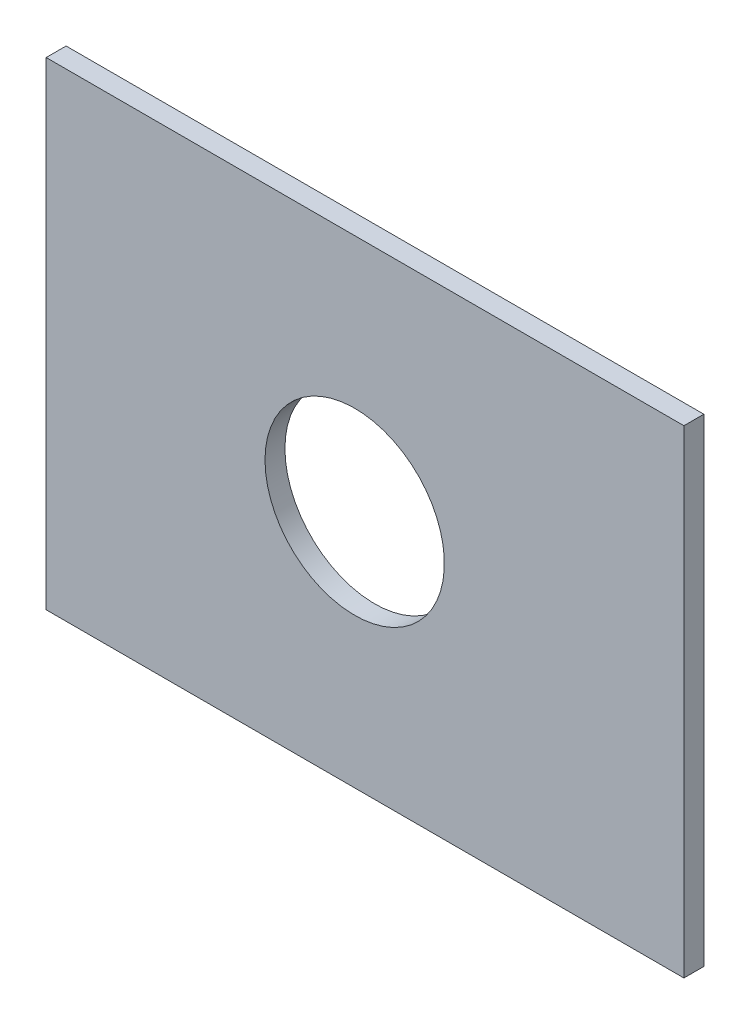
ISO-10303-21;
HEADER;
FILE_DESCRIPTION(('STEP AP214'),'2;1');
FILE_NAME('part.step','',(''),(''),'','','');
FILE_SCHEMA(('AUTOMOTIVE_DESIGN { 1 0 10303 214 1 1 1 1 }'));
ENDSEC;
DATA;
#1=APPLICATION_CONTEXT('core data for automotive mechanical design processes');
#2=APPLICATION_PROTOCOL_DEFINITION('international standard','automotive_design',2000,#1);
#3=PRODUCT_CONTEXT('',#1,'mechanical');
#4=PRODUCT('Part','Part','',(#3));
#5=PRODUCT_RELATED_PRODUCT_CATEGORY('part','',(#4));
#6=PRODUCT_DEFINITION_FORMATION('','',#4);
#7=PRODUCT_DEFINITION_CONTEXT('part definition',#1,'design');
#8=PRODUCT_DEFINITION('design','',#6,#7);
#9=PRODUCT_DEFINITION_SHAPE('','',#8);
#10=(LENGTH_UNIT() NAMED_UNIT(*) SI_UNIT(.MILLI.,.METRE.));
#11=(NAMED_UNIT(*) PLANE_ANGLE_UNIT() SI_UNIT($,.RADIAN.));
#12=(NAMED_UNIT(*) SI_UNIT($,.STERADIAN.) SOLID_ANGLE_UNIT());
#13=UNCERTAINTY_MEASURE_WITH_UNIT(LENGTH_MEASURE(1.E-05),#10,'distance_accuracy_value','');
#14=(GEOMETRIC_REPRESENTATION_CONTEXT(3) GLOBAL_UNCERTAINTY_ASSIGNED_CONTEXT((#13)) GLOBAL_UNIT_ASSIGNED_CONTEXT((#10,
#11,#12)) REPRESENTATION_CONTEXT('',''));
#15=CARTESIAN_POINT('',(0.,0.,0.));
#16=DIRECTION('',(0.,0.,1.));
#17=DIRECTION('',(1.,0.,0.));
#18=AXIS2_PLACEMENT_3D('',#15,#16,#17);
#19=CARTESIAN_POINT('',(0.,0.,-1439.49432926689));
#20=DIRECTION('',(0.,0.,1.));
#21=DIRECTION('',(1.,0.,0.));
#22=AXIS2_PLACEMENT_3D('',#19,#20,#21);
#23=PLANE('',#22);
#24=DIRECTION('',(0.,1.,0.));
#25=VECTOR('',#24,1.);
#26=CARTESIAN_POINT('',(-2270.31515009842,147.889080750159,-1439.49432926689));
#27=LINE('',#26,#25);
#28=CARTESIAN_POINT('',(-2270.31515009842,147.889080750159,-1439.49432926689));
#29=VERTEX_POINT('',#28);
#30=CARTESIAN_POINT('',(-2270.31515009842,224.089080750159,-1439.49432926689));
#31=VERTEX_POINT('',#30);
#32=EDGE_CURVE('E88',#29,#31,#27,.T.);
#33=ORIENTED_EDGE('',*,*,#32,.T.);
#34=DIRECTION('',(1.,0.,0.));
#35=VECTOR('',#34,1.);
#36=CARTESIAN_POINT('',(-2168.71515009842,224.089080750159,-1439.49432926689));
#37=LINE('',#36,#35);
#38=CARTESIAN_POINT('',(-2168.71515009842,224.089080750159,-1439.49432926689));
#39=VERTEX_POINT('',#38);
#40=EDGE_CURVE('E83',#31,#39,#37,.T.);
#41=ORIENTED_EDGE('',*,*,#40,.T.);
#42=DIRECTION('',(0.,-1.,0.));
#43=VECTOR('',#42,1.);
#44=CARTESIAN_POINT('',(-2168.71515009842,147.889080750159,-1439.49432926689));
#45=LINE('',#44,#43);
#46=CARTESIAN_POINT('',(-2168.71515009842,147.889080750159,-1439.49432926689));
#47=VERTEX_POINT('',#46);
#48=EDGE_CURVE('E86',#39,#47,#45,.T.);
#49=ORIENTED_EDGE('',*,*,#48,.T.);
#50=DIRECTION('',(-1.,0.,0.));
#51=VECTOR('',#50,1.);
#52=CARTESIAN_POINT('',(-2168.71515009842,147.889080750159,-1439.49432926689));
#53=LINE('',#52,#51);
#54=EDGE_CURVE('E53',#47,#29,#53,.T.);
#55=ORIENTED_EDGE('',*,*,#54,.T.);
#56=EDGE_LOOP('',(#33,#41,#49,#55));
#57=FACE_BOUND('',#56,.T.);
#58=CARTESIAN_POINT('',(-2221.16513035462,185.989080750166,-1439.49432926689));
#59=DIRECTION('',(0.,0.,-1.));
#60=DIRECTION('',(-1.,0.,0.));
#61=AXIS2_PLACEMENT_3D('',#58,#59,#60);
#62=CIRCLE('',#61,14.287499999999);
#63=CARTESIAN_POINT('',(-2235.45263035462,185.989080750166,-1439.49432926689));
#64=VERTEX_POINT('',#63);
#65=EDGE_CURVE('E103',#64,#64,#62,.T.);
#66=ORIENTED_EDGE('',*,*,#65,.F.);
#67=EDGE_LOOP('',(#66));
#68=FACE_BOUND('',#67,.T.);
#69=ADVANCED_FACE('F36',(#57,#68),#23,.F.);
#70=CARTESIAN_POINT('',(0.,0.,-1436.31932926689));
#71=DIRECTION('',(0.,0.,1.));
#72=DIRECTION('',(1.,0.,0.));
#73=AXIS2_PLACEMENT_3D('',#70,#71,#72);
#74=PLANE('',#73);
#75=DIRECTION('',(0.,1.,0.));
#76=VECTOR('',#75,1.);
#77=CARTESIAN_POINT('',(-2270.31515009842,147.889080750159,-1436.31932926689));
#78=LINE('',#77,#76);
#79=CARTESIAN_POINT('',(-2270.31515009842,147.889080750159,-1436.31932926689));
#80=VERTEX_POINT('',#79);
#81=CARTESIAN_POINT('',(-2270.31515009842,224.089080750159,-1436.31932926689));
#82=VERTEX_POINT('',#81);
#83=EDGE_CURVE('E100',#80,#82,#78,.T.);
#84=ORIENTED_EDGE('',*,*,#83,.F.);
#85=DIRECTION('',(-1.,0.,0.));
#86=VECTOR('',#85,1.);
#87=CARTESIAN_POINT('',(-2168.71515009842,147.889080750159,-1436.31932926689));
#88=LINE('',#87,#86);
#89=CARTESIAN_POINT('',(-2168.71515009842,147.889080750159,-1436.31932926689));
#90=VERTEX_POINT('',#89);
#91=EDGE_CURVE('E76',#90,#80,#88,.T.);
#92=ORIENTED_EDGE('',*,*,#91,.F.);
#93=DIRECTION('',(0.,-1.,0.));
#94=VECTOR('',#93,1.);
#95=CARTESIAN_POINT('',(-2168.71515009842,147.889080750159,-1436.31932926689));
#96=LINE('',#95,#94);
#97=CARTESIAN_POINT('',(-2168.71515009842,224.089080750159,-1436.31932926689));
#98=VERTEX_POINT('',#97);
#99=EDGE_CURVE('E70',#98,#90,#96,.T.);
#100=ORIENTED_EDGE('',*,*,#99,.F.);
#101=DIRECTION('',(1.,0.,0.));
#102=VECTOR('',#101,1.);
#103=CARTESIAN_POINT('',(-2168.71515009842,224.089080750159,-1436.31932926689));
#104=LINE('',#103,#102);
#105=EDGE_CURVE('E92',#82,#98,#104,.T.);
#106=ORIENTED_EDGE('',*,*,#105,.F.);
#107=EDGE_LOOP('',(#84,#92,#100,#106));
#108=FACE_BOUND('',#107,.T.);
#109=CARTESIAN_POINT('',(-2221.16513035462,185.989080750166,-1436.31932926689));
#110=DIRECTION('',(0.,0.,-1.));
#111=DIRECTION('',(-1.,0.,0.));
#112=AXIS2_PLACEMENT_3D('',#109,#110,#111);
#113=CIRCLE('',#112,14.287499999999);
#114=CARTESIAN_POINT('',(-2235.45263035462,185.989080750166,-1436.31932926689));
#115=VERTEX_POINT('',#114);
#116=EDGE_CURVE('E115',#115,#115,#113,.T.);
#117=ORIENTED_EDGE('',*,*,#116,.T.);
#118=EDGE_LOOP('',(#117));
#119=FACE_BOUND('',#118,.T.);
#120=ADVANCED_FACE('F111',(#108,#119),#74,.T.);
#121=CARTESIAN_POINT('',(-2270.31515009842,147.889080750159,-1439.49432926689));
#122=DIRECTION('',(1.,0.,0.));
#123=DIRECTION('',(0.,0.,-1.));
#124=AXIS2_PLACEMENT_3D('',#121,#122,#123);
#125=PLANE('',#124);
#126=ORIENTED_EDGE('',*,*,#83,.T.);
#127=DIRECTION('',(0.,0.,1.));
#128=VECTOR('',#127,1.);
#129=CARTESIAN_POINT('',(-2270.31515009842,224.089080750159,-1439.49432926689));
#130=LINE('',#129,#128);
#131=EDGE_CURVE('E11',#31,#82,#130,.T.);
#132=ORIENTED_EDGE('',*,*,#131,.F.);
#133=ORIENTED_EDGE('',*,*,#32,.F.);
#134=DIRECTION('',(0.,0.,1.));
#135=VECTOR('',#134,1.);
#136=CARTESIAN_POINT('',(-2270.31515009842,147.889080750159,-1439.49432926689));
#137=LINE('',#136,#135);
#138=EDGE_CURVE('E96',#29,#80,#137,.T.);
#139=ORIENTED_EDGE('',*,*,#138,.T.);
#140=EDGE_LOOP('',(#126,#132,#133,#139));
#141=FACE_BOUND('',#140,.T.);
#142=ADVANCED_FACE('F38',(#141),#125,.F.);
#143=CARTESIAN_POINT('',(-2168.71515009842,224.089080750159,-1439.49432926689));
#144=DIRECTION('',(0.,-1.,0.));
#145=DIRECTION('',(1.,0.,0.));
#146=AXIS2_PLACEMENT_3D('',#143,#144,#145);
#147=PLANE('',#146);
#148=ORIENTED_EDGE('',*,*,#105,.T.);
#149=DIRECTION('',(0.,0.,1.));
#150=VECTOR('',#149,1.);
#151=CARTESIAN_POINT('',(-2168.71515009842,224.089080750159,-1439.49432926689));
#152=LINE('',#151,#150);
#153=EDGE_CURVE('E45',#39,#98,#152,.T.);
#154=ORIENTED_EDGE('',*,*,#153,.F.);
#155=ORIENTED_EDGE('',*,*,#40,.F.);
#156=ORIENTED_EDGE('',*,*,#131,.T.);
#157=EDGE_LOOP('',(#148,#154,#155,#156));
#158=FACE_BOUND('',#157,.T.);
#159=ADVANCED_FACE('F91',(#158),#147,.F.);
#160=CARTESIAN_POINT('',(-2168.71515009842,147.889080750159,-1439.49432926689));
#161=DIRECTION('',(-1.,0.,0.));
#162=DIRECTION('',(0.,0.,1.));
#163=AXIS2_PLACEMENT_3D('',#160,#161,#162);
#164=PLANE('',#163);
#165=ORIENTED_EDGE('',*,*,#99,.T.);
#166=DIRECTION('',(0.,0.,1.));
#167=VECTOR('',#166,1.);
#168=CARTESIAN_POINT('',(-2168.71515009842,147.889080750159,-1439.49432926689));
#169=LINE('',#168,#167);
#170=EDGE_CURVE('E93',#47,#90,#169,.T.);
#171=ORIENTED_EDGE('',*,*,#170,.F.);
#172=ORIENTED_EDGE('',*,*,#48,.F.);
#173=ORIENTED_EDGE('',*,*,#153,.T.);
#174=EDGE_LOOP('',(#165,#171,#172,#173));
#175=FACE_BOUND('',#174,.T.);
#176=ADVANCED_FACE('F94',(#175),#164,.F.);
#177=CARTESIAN_POINT('',(-2168.71515009842,147.889080750159,-1439.49432926689));
#178=DIRECTION('',(0.,1.,0.));
#179=DIRECTION('',(0.,0.,1.));
#180=AXIS2_PLACEMENT_3D('',#177,#178,#179);
#181=PLANE('',#180);
#182=ORIENTED_EDGE('',*,*,#91,.T.);
#183=ORIENTED_EDGE('',*,*,#138,.F.);
#184=ORIENTED_EDGE('',*,*,#54,.F.);
#185=ORIENTED_EDGE('',*,*,#170,.T.);
#186=EDGE_LOOP('',(#182,#183,#184,#185));
#187=FACE_BOUND('',#186,.T.);
#188=ADVANCED_FACE('F108',(#187),#181,.F.);
#189=CARTESIAN_POINT('',(-2221.16513035462,185.989080750166,-1439.49432926689));
#190=DIRECTION('',(0.,0.,1.));
#191=DIRECTION('',(1.,0.,0.));
#192=AXIS2_PLACEMENT_3D('',#189,#190,#191);
#193=CYLINDRICAL_SURFACE('',#192,14.287499999999);
#194=ORIENTED_EDGE('',*,*,#65,.T.);
#195=EDGE_LOOP('',(#194));
#196=FACE_BOUND('',#195,.T.);
#197=ORIENTED_EDGE('',*,*,#116,.F.);
#198=EDGE_LOOP('',(#197));
#199=FACE_BOUND('',#198,.T.);
#200=ADVANCED_FACE('F121',(#196,#199),#193,.F.);
#201=CLOSED_SHELL('',(#69,#120,#142,#159,#176,#188,#200));
#202=MANIFOLD_SOLID_BREP('B2',#201);
#203=ADVANCED_BREP_SHAPE_REPRESENTATION('',(#18,#202),#14);
#204=SHAPE_DEFINITION_REPRESENTATION(#9,#203);
ENDSEC;
END-ISO-10303-21;
